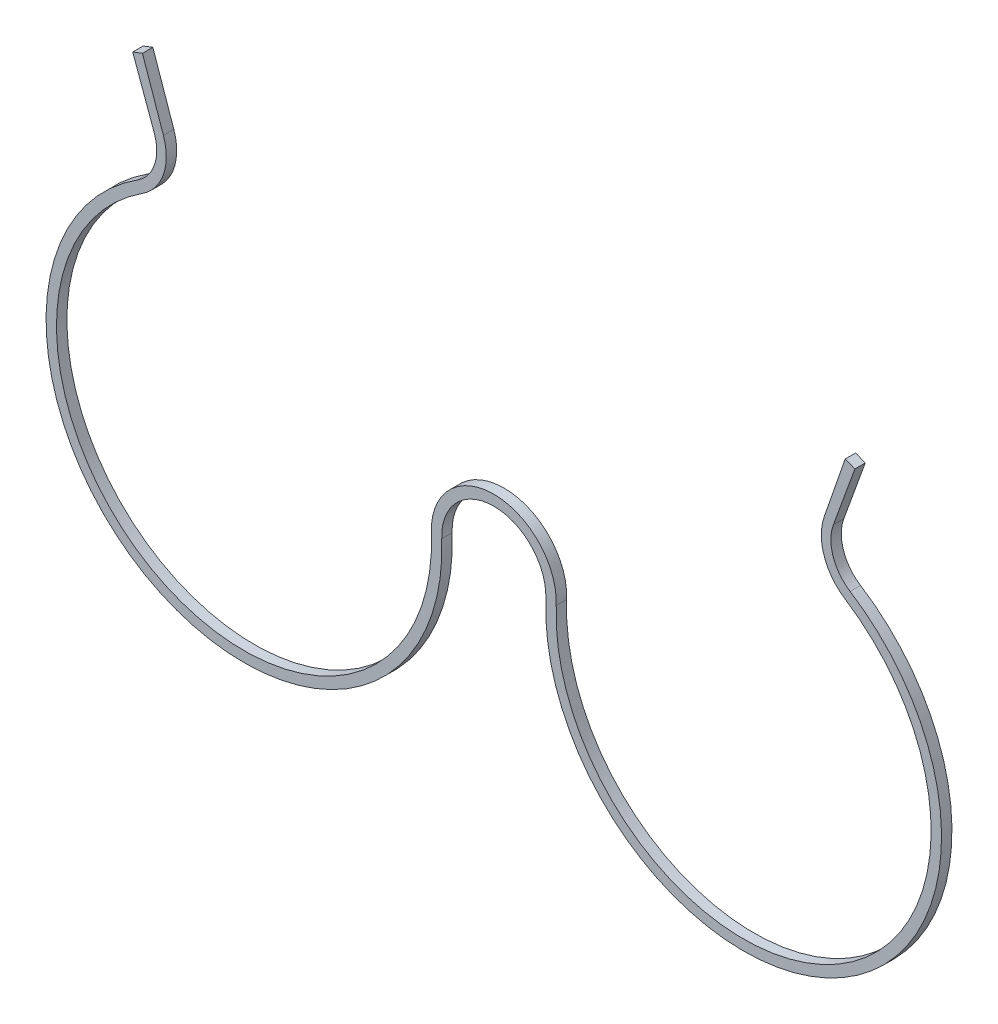
ISO-10303-21;
HEADER;
FILE_DESCRIPTION(('STEP AP214'),'2;1');
FILE_NAME('part.step','',(''),(''),'','','');
FILE_SCHEMA(('AUTOMOTIVE_DESIGN { 1 0 10303 214 1 1 1 1 }'));
ENDSEC;
DATA;
#1=APPLICATION_CONTEXT('core data for automotive mechanical design processes');
#2=APPLICATION_PROTOCOL_DEFINITION('international standard','automotive_design',2000,#1);
#3=PRODUCT_CONTEXT('',#1,'mechanical');
#4=PRODUCT('Part','Part','',(#3));
#5=PRODUCT_RELATED_PRODUCT_CATEGORY('part','',(#4));
#6=PRODUCT_DEFINITION_FORMATION('','',#4);
#7=PRODUCT_DEFINITION_CONTEXT('part definition',#1,'design');
#8=PRODUCT_DEFINITION('design','',#6,#7);
#9=PRODUCT_DEFINITION_SHAPE('','',#8);
#10=(LENGTH_UNIT() NAMED_UNIT(*) SI_UNIT(.MILLI.,.METRE.));
#11=(NAMED_UNIT(*) PLANE_ANGLE_UNIT() SI_UNIT($,.RADIAN.));
#12=(NAMED_UNIT(*) SI_UNIT($,.STERADIAN.) SOLID_ANGLE_UNIT());
#13=UNCERTAINTY_MEASURE_WITH_UNIT(LENGTH_MEASURE(1.E-05),#10,'distance_accuracy_value','');
#14=(GEOMETRIC_REPRESENTATION_CONTEXT(3) GLOBAL_UNCERTAINTY_ASSIGNED_CONTEXT((#13)) GLOBAL_UNIT_ASSIGNED_CONTEXT((#10,
#11,#12)) REPRESENTATION_CONTEXT('',''));
#15=CARTESIAN_POINT('',(0.,0.,0.));
#16=DIRECTION('',(0.,0.,1.));
#17=DIRECTION('',(1.,0.,0.));
#18=AXIS2_PLACEMENT_3D('',#15,#16,#17);
#19=CARTESIAN_POINT('',(0.0208423834364042,0.999999999999996,-1.));
#20=DIRECTION('',(0.,0.,1.));
#21=DIRECTION('',(1.,0.,0.));
#22=AXIS2_PLACEMENT_3D('',#19,#20,#21);
#23=CYLINDRICAL_SURFACE('',#22,4.99999999999999);
#24=CARTESIAN_POINT('',(0.0208423834364042,0.999999999999996,0.));
#25=DIRECTION('',(0.,0.,-1.));
#26=DIRECTION('',(1.,0.,0.));
#27=AXIS2_PLACEMENT_3D('',#24,#25,#26);
#28=CIRCLE('',#27,4.99999999999999);
#29=CARTESIAN_POINT('',(-4.97481545334767,0.79166666666666,0.));
#30=VERTEX_POINT('',#29);
#31=CARTESIAN_POINT('',(5.01650022022048,0.79166666666666,0.));
#32=VERTEX_POINT('',#31);
#33=EDGE_CURVE('E137',#30,#32,#28,.T.);
#34=ORIENTED_EDGE('',*,*,#33,.F.);
#35=DIRECTION('',(0.,0.,1.));
#36=VECTOR('',#35,1.);
#37=CARTESIAN_POINT('',(-4.97481545334767,0.79166666666666,-1.));
#38=LINE('',#37,#36);
#39=CARTESIAN_POINT('',(-4.97481545334767,0.79166666666666,-1.));
#40=VERTEX_POINT('',#39);
#41=EDGE_CURVE('E193',#40,#30,#38,.T.);
#42=ORIENTED_EDGE('',*,*,#41,.F.);
#43=CARTESIAN_POINT('',(0.0208423834364042,0.999999999999996,-1.));
#44=DIRECTION('',(0.,0.,-1.));
#45=DIRECTION('',(1.,0.,0.));
#46=AXIS2_PLACEMENT_3D('',#43,#44,#45);
#47=CIRCLE('',#46,4.99999999999999);
#48=CARTESIAN_POINT('',(5.01650022022048,0.79166666666666,-1.));
#49=VERTEX_POINT('',#48);
#50=EDGE_CURVE('E161',#40,#49,#47,.T.);
#51=ORIENTED_EDGE('',*,*,#50,.T.);
#52=DIRECTION('',(0.,0.,1.));
#53=VECTOR('',#52,1.);
#54=CARTESIAN_POINT('',(5.01650022022048,0.79166666666666,-1.));
#55=LINE('',#54,#53);
#56=EDGE_CURVE('E36',#49,#32,#55,.T.);
#57=ORIENTED_EDGE('',*,*,#56,.T.);
#58=EDGE_LOOP('',(#34,#42,#51,#57));
#59=FACE_BOUND('',#58,.T.);
#60=ADVANCED_FACE('F33',(#59),#23,.F.);
#61=CARTESIAN_POINT('',(0.0208423834364042,0.999999999999996,-1.));
#62=DIRECTION('',(0.,0.,1.));
#63=DIRECTION('',(1.,0.,0.));
#64=AXIS2_PLACEMENT_3D('',#61,#62,#63);
#65=CYLINDRICAL_SURFACE('',#64,6.);
#66=CARTESIAN_POINT('',(0.0208423834364042,0.999999999999996,0.));
#67=DIRECTION('',(0.,0.,1.));
#68=DIRECTION('',(1.,0.,0.));
#69=AXIS2_PLACEMENT_3D('',#66,#67,#68);
#70=CIRCLE('',#69,6.);
#71=CARTESIAN_POINT('',(6.0156317875773,0.749999999999993,0.));
#72=VERTEX_POINT('',#71);
#73=CARTESIAN_POINT('',(-5.97394702070449,0.749999999999993,0.));
#74=VERTEX_POINT('',#73);
#75=EDGE_CURVE('E159',#72,#74,#70,.T.);
#76=ORIENTED_EDGE('',*,*,#75,.F.);
#77=DIRECTION('',(0.,0.,1.));
#78=VECTOR('',#77,1.);
#79=CARTESIAN_POINT('',(6.0156317875773,0.749999999999993,-1.));
#80=LINE('',#79,#78);
#81=CARTESIAN_POINT('',(6.0156317875773,0.749999999999993,-1.));
#82=VERTEX_POINT('',#81);
#83=EDGE_CURVE('E11',#82,#72,#80,.T.);
#84=ORIENTED_EDGE('',*,*,#83,.F.);
#85=CARTESIAN_POINT('',(0.0208423834364042,0.999999999999996,-1.));
#86=DIRECTION('',(0.,0.,1.));
#87=DIRECTION('',(1.,0.,0.));
#88=AXIS2_PLACEMENT_3D('',#85,#86,#87);
#89=CIRCLE('',#88,6.);
#90=CARTESIAN_POINT('',(-5.97394702070449,0.749999999999993,-1.));
#91=VERTEX_POINT('',#90);
#92=EDGE_CURVE('E135',#82,#91,#89,.T.);
#93=ORIENTED_EDGE('',*,*,#92,.T.);
#94=DIRECTION('',(0.,0.,1.));
#95=VECTOR('',#94,1.);
#96=CARTESIAN_POINT('',(-5.97394702070449,0.749999999999993,-1.));
#97=LINE('',#96,#95);
#98=EDGE_CURVE('E141',#91,#74,#97,.T.);
#99=ORIENTED_EDGE('',*,*,#98,.T.);
#100=EDGE_LOOP('',(#76,#84,#93,#99));
#101=FACE_BOUND('',#100,.T.);
#102=ADVANCED_FACE('F233',(#101),#65,.T.);
#103=CARTESIAN_POINT('',(24.,0.,-1.));
#104=DIRECTION('',(0.,0.,1.));
#105=DIRECTION('',(1.,0.,0.));
#106=AXIS2_PLACEMENT_3D('',#103,#104,#105);
#107=CYLINDRICAL_SURFACE('',#106,18.);
#108=CARTESIAN_POINT('',(24.,0.,0.));
#109=DIRECTION('',(0.,0.,-1.));
#110=DIRECTION('',(1.,0.,0.));
#111=AXIS2_PLACEMENT_3D('',#108,#109,#110);
#112=CIRCLE('',#111,18.);
#113=CARTESIAN_POINT('',(33.7500402856871,15.1306547917623,0.));
#114=VERTEX_POINT('',#113);
#115=EDGE_CURVE('E156',#114,#72,#112,.T.);
#116=ORIENTED_EDGE('',*,*,#115,.F.);
#117=DIRECTION('',(0.,0.,1.));
#118=VECTOR('',#117,1.);
#119=CARTESIAN_POINT('',(33.7500402856871,15.1306547917623,-1.));
#120=LINE('',#119,#118);
#121=CARTESIAN_POINT('',(33.7500402856871,15.1306547917623,-1.));
#122=VERTEX_POINT('',#121);
#123=EDGE_CURVE('E42',#122,#114,#120,.T.);
#124=ORIENTED_EDGE('',*,*,#123,.F.);
#125=CARTESIAN_POINT('',(24.,0.,-1.));
#126=DIRECTION('',(0.,0.,-1.));
#127=DIRECTION('',(1.,0.,0.));
#128=AXIS2_PLACEMENT_3D('',#125,#126,#127);
#129=CIRCLE('',#128,18.);
#130=EDGE_CURVE('E125',#122,#82,#129,.T.);
#131=ORIENTED_EDGE('',*,*,#130,.T.);
#132=ORIENTED_EDGE('',*,*,#83,.T.);
#133=EDGE_LOOP('',(#116,#124,#131,#132));
#134=FACE_BOUND('',#133,.T.);
#135=ADVANCED_FACE('F237',(#134),#107,.F.);
#136=CARTESIAN_POINT('',(36.4583848094891,19.3336144561407,-1.));
#137=DIRECTION('',(0.,0.,1.));
#138=DIRECTION('',(1.,0.,0.));
#139=AXIS2_PLACEMENT_3D('',#136,#137,#138);
#140=CYLINDRICAL_SURFACE('',#139,5.);
#141=CARTESIAN_POINT('',(36.4583848094891,19.3336144561407,0.));
#142=DIRECTION('',(0.,0.,1.));
#143=DIRECTION('',(-1.,0.,0.));
#144=AXIS2_PLACEMENT_3D('',#141,#142,#143);
#145=CIRCLE('',#144,5.);
#146=CARTESIAN_POINT('',(31.7340197536941,20.9707994852633,0.));
#147=VERTEX_POINT('',#146);
#148=EDGE_CURVE('E110',#147,#114,#145,.T.);
#149=ORIENTED_EDGE('',*,*,#148,.F.);
#150=DIRECTION('',(0.,0.,1.));
#151=VECTOR('',#150,1.);
#152=CARTESIAN_POINT('',(31.7340197536941,20.9707994852633,-1.));
#153=LINE('',#152,#151);
#154=CARTESIAN_POINT('',(31.7340197536941,20.9707994852633,-1.));
#155=VERTEX_POINT('',#154);
#156=EDGE_CURVE('E105',#155,#147,#153,.T.);
#157=ORIENTED_EDGE('',*,*,#156,.F.);
#158=CARTESIAN_POINT('',(36.4583848094891,19.3336144561407,-1.));
#159=DIRECTION('',(0.,0.,1.));
#160=DIRECTION('',(-1.,0.,0.));
#161=AXIS2_PLACEMENT_3D('',#158,#159,#160);
#162=CIRCLE('',#161,5.);
#163=EDGE_CURVE('E108',#155,#122,#162,.T.);
#164=ORIENTED_EDGE('',*,*,#163,.T.);
#165=ORIENTED_EDGE('',*,*,#123,.T.);
#166=EDGE_LOOP('',(#149,#157,#164,#165));
#167=FACE_BOUND('',#166,.T.);
#168=ADVANCED_FACE('F107',(#167),#140,.T.);
#169=CARTESIAN_POINT('',(33.7475740847815,26.7812396923984,-1.));
#170=DIRECTION('',(-0.944873011158995,0.32743700582453,0.));
#171=DIRECTION('',(-0.32743700582453,-0.944873011158995,0.));
#172=AXIS2_PLACEMENT_3D('',#169,#170,#171);
#173=PLANE('',#172);
#174=DIRECTION('',(-0.32743700582453,-0.944873011158995,0.));
#175=VECTOR('',#174,1.);
#176=CARTESIAN_POINT('',(33.7475740847815,26.7812396923984,0.));
#177=LINE('',#176,#175);
#178=CARTESIAN_POINT('',(33.7475740847815,26.7812396923984,0.));
#179=VERTEX_POINT('',#178);
#180=EDGE_CURVE('E153',#179,#147,#177,.T.);
#181=ORIENTED_EDGE('',*,*,#180,.F.);
#182=DIRECTION('',(0.,0.,1.));
#183=VECTOR('',#182,1.);
#184=CARTESIAN_POINT('',(33.7475740847815,26.7812396923984,-1.));
#185=LINE('',#184,#183);
#186=CARTESIAN_POINT('',(33.7475740847815,26.7812396923984,-1.));
#187=VERTEX_POINT('',#186);
#188=EDGE_CURVE('E115',#187,#179,#185,.T.);
#189=ORIENTED_EDGE('',*,*,#188,.F.);
#190=DIRECTION('',(-0.32743700582453,-0.944873011158995,0.));
#191=VECTOR('',#190,1.);
#192=CARTESIAN_POINT('',(33.7475740847815,26.7812396923984,-1.));
#193=LINE('',#192,#191);
#194=EDGE_CURVE('E123',#187,#155,#193,.T.);
#195=ORIENTED_EDGE('',*,*,#194,.T.);
#196=ORIENTED_EDGE('',*,*,#156,.T.);
#197=EDGE_LOOP('',(#181,#189,#195,#196));
#198=FACE_BOUND('',#197,.T.);
#199=ADVANCED_FACE('F127',(#198),#173,.T.);
#200=CARTESIAN_POINT('',(24.,0.,-1.));
#201=DIRECTION('',(0.,0.,1.));
#202=DIRECTION('',(1.,0.,0.));
#203=AXIS2_PLACEMENT_3D('',#200,#201,#202);
#204=CYLINDRICAL_SURFACE('',#203,28.5);
#205=CARTESIAN_POINT('',(24.,0.,0.));
#206=DIRECTION('',(0.,0.,1.));
#207=DIRECTION('',(1.,0.,0.));
#208=AXIS2_PLACEMENT_3D('',#205,#206,#207);
#209=CIRCLE('',#208,28.5);
#210=CARTESIAN_POINT('',(34.6812645042071,26.4227286363684,0.));
#211=VERTEX_POINT('',#210);
#212=EDGE_CURVE('E150',#211,#179,#209,.T.);
#213=ORIENTED_EDGE('',*,*,#212,.F.);
#214=DIRECTION('',(0.,0.,1.));
#215=VECTOR('',#214,1.);
#216=CARTESIAN_POINT('',(34.6812645042071,26.4227286363684,-1.));
#217=LINE('',#216,#215);
#218=CARTESIAN_POINT('',(34.6812645042071,26.4227286363684,-1.));
#219=VERTEX_POINT('',#218);
#220=EDGE_CURVE('E165',#219,#211,#217,.T.);
#221=ORIENTED_EDGE('',*,*,#220,.F.);
#222=CARTESIAN_POINT('',(24.,0.,-1.));
#223=DIRECTION('',(0.,0.,1.));
#224=DIRECTION('',(1.,0.,0.));
#225=AXIS2_PLACEMENT_3D('',#222,#223,#224);
#226=CIRCLE('',#225,28.5);
#227=EDGE_CURVE('E128',#219,#187,#226,.T.);
#228=ORIENTED_EDGE('',*,*,#227,.T.);
#229=ORIENTED_EDGE('',*,*,#188,.T.);
#230=EDGE_LOOP('',(#213,#221,#228,#229));
#231=FACE_BOUND('',#230,.T.);
#232=ADVANCED_FACE('F223',(#231),#204,.T.);
#233=CARTESIAN_POINT('',(34.6812645042071,26.4227286363684,-1.));
#234=DIRECTION('',(0.93969262078591,-0.342020143325664,0.));
#235=DIRECTION('',(0.342020143325664,0.93969262078591,0.));
#236=AXIS2_PLACEMENT_3D('',#233,#234,#235);
#237=PLANE('',#236);
#238=DIRECTION('',(0.342020143325664,0.93969262078591,0.));
#239=VECTOR('',#238,1.);
#240=CARTESIAN_POINT('',(34.6812645042071,26.4227286363684,0.));
#241=LINE('',#240,#239);
#242=CARTESIAN_POINT('',(32.6180257949857,20.7540268718377,0.));
#243=VERTEX_POINT('',#242);
#244=EDGE_CURVE('E147',#243,#211,#241,.T.);
#245=ORIENTED_EDGE('',*,*,#244,.F.);
#246=DIRECTION('',(0.,0.,1.));
#247=VECTOR('',#246,1.);
#248=CARTESIAN_POINT('',(32.6180257949857,20.7540268718377,-1.));
#249=LINE('',#248,#247);
#250=CARTESIAN_POINT('',(32.6180257949857,20.7540268718377,-1.));
#251=VERTEX_POINT('',#250);
#252=EDGE_CURVE('E167',#251,#243,#249,.T.);
#253=ORIENTED_EDGE('',*,*,#252,.F.);
#254=DIRECTION('',(0.342020143325664,0.93969262078591,0.));
#255=VECTOR('',#254,1.);
#256=CARTESIAN_POINT('',(34.6812645042071,26.4227286363684,-1.));
#257=LINE('',#256,#255);
#258=EDGE_CURVE('E130',#251,#219,#257,.T.);
#259=ORIENTED_EDGE('',*,*,#258,.T.);
#260=ORIENTED_EDGE('',*,*,#220,.T.);
#261=EDGE_LOOP('',(#245,#253,#259,#260));
#262=FACE_BOUND('',#261,.T.);
#263=ADVANCED_FACE('F217',(#262),#237,.T.);
#264=CARTESIAN_POINT('',(36.3767962781293,19.385946298535,-1.));
#265=DIRECTION('',(0.,0.,1.));
#266=DIRECTION('',(1.,0.,0.));
#267=AXIS2_PLACEMENT_3D('',#264,#265,#266);
#268=CYLINDRICAL_SURFACE('',#267,4.);
#269=CARTESIAN_POINT('',(36.3767962781293,19.385946298535,0.));
#270=DIRECTION('',(0.,0.,-1.));
#271=DIRECTION('',(-1.,0.,0.));
#272=AXIS2_PLACEMENT_3D('',#269,#270,#271);
#273=CIRCLE('',#272,4.);
#274=CARTESIAN_POINT('',(34.2243099688894,16.0144773770507,0.));
#275=VERTEX_POINT('',#274);
#276=EDGE_CURVE('E144',#275,#243,#273,.T.);
#277=ORIENTED_EDGE('',*,*,#276,.F.);
#278=DIRECTION('',(0.,0.,1.));
#279=VECTOR('',#278,1.);
#280=CARTESIAN_POINT('',(34.2243099688894,16.0144773770507,-1.));
#281=LINE('',#280,#279);
#282=CARTESIAN_POINT('',(34.2243099688894,16.0144773770507,-1.));
#283=VERTEX_POINT('',#282);
#284=EDGE_CURVE('E168',#283,#275,#281,.T.);
#285=ORIENTED_EDGE('',*,*,#284,.F.);
#286=CARTESIAN_POINT('',(36.3767962781293,19.385946298535,-1.));
#287=DIRECTION('',(0.,0.,-1.));
#288=DIRECTION('',(-1.,0.,0.));
#289=AXIS2_PLACEMENT_3D('',#286,#287,#288);
#290=CIRCLE('',#289,4.);
#291=EDGE_CURVE('E211',#283,#251,#290,.T.);
#292=ORIENTED_EDGE('',*,*,#291,.T.);
#293=ORIENTED_EDGE('',*,*,#252,.T.);
#294=EDGE_LOOP('',(#277,#285,#292,#293));
#295=FACE_BOUND('',#294,.T.);
#296=ADVANCED_FACE('F221',(#295),#268,.F.);
#297=CARTESIAN_POINT('',(24.,0.,-1.));
#298=DIRECTION('',(0.,0.,1.));
#299=DIRECTION('',(1.,0.,0.));
#300=AXIS2_PLACEMENT_3D('',#297,#298,#299);
#301=CYLINDRICAL_SURFACE('',#300,19.);
#302=CARTESIAN_POINT('',(24.,0.,0.));
#303=DIRECTION('',(0.,0.,1.));
#304=DIRECTION('',(1.,0.,0.));
#305=AXIS2_PLACEMENT_3D('',#302,#303,#304);
#306=CIRCLE('',#305,19.);
#307=EDGE_CURVE('E140',#32,#275,#306,.T.);
#308=ORIENTED_EDGE('',*,*,#307,.F.);
#309=ORIENTED_EDGE('',*,*,#56,.F.);
#310=CARTESIAN_POINT('',(24.,0.,-1.));
#311=DIRECTION('',(0.,0.,1.));
#312=DIRECTION('',(1.,0.,0.));
#313=AXIS2_PLACEMENT_3D('',#310,#311,#312);
#314=CIRCLE('',#313,19.);
#315=EDGE_CURVE('E209',#49,#283,#314,.T.);
#316=ORIENTED_EDGE('',*,*,#315,.T.);
#317=ORIENTED_EDGE('',*,*,#284,.T.);
#318=EDGE_LOOP('',(#308,#309,#316,#317));
#319=FACE_BOUND('',#318,.T.);
#320=ADVANCED_FACE('F176',(#319),#301,.T.);
#321=CARTESIAN_POINT('',(0.0208423834364042,0.999999999999996,-1.));
#322=DIRECTION('',(0.,0.,1.));
#323=DIRECTION('',(1.,0.,0.));
#324=AXIS2_PLACEMENT_3D('',#321,#322,#323);
#325=PLANE('',#324);
#326=ORIENTED_EDGE('',*,*,#50,.F.);
#327=CARTESIAN_POINT('',(-23.9583152331272,0.,-1.));
#328=DIRECTION('',(0.,0.,-1.));
#329=DIRECTION('',(-1.,0.,0.));
#330=AXIS2_PLACEMENT_3D('',#327,#328,#329);
#331=CIRCLE('',#330,19.);
#332=CARTESIAN_POINT('',(-34.1826252020166,16.0144773770507,-1.));
#333=VERTEX_POINT('',#332);
#334=EDGE_CURVE('E197',#40,#333,#331,.T.);
#335=ORIENTED_EDGE('',*,*,#334,.T.);
#336=CARTESIAN_POINT('',(-36.3351115112565,19.385946298535,-1.));
#337=DIRECTION('',(0.,0.,1.));
#338=DIRECTION('',(1.,0.,0.));
#339=AXIS2_PLACEMENT_3D('',#336,#337,#338);
#340=CIRCLE('',#339,4.);
#341=CARTESIAN_POINT('',(-32.5763410281129,20.7540268718377,-1.));
#342=VERTEX_POINT('',#341);
#343=EDGE_CURVE('E460',#333,#342,#340,.T.);
#344=ORIENTED_EDGE('',*,*,#343,.T.);
#345=DIRECTION('',(-0.342020143325664,0.93969262078591,0.));
#346=VECTOR('',#345,1.);
#347=CARTESIAN_POINT('',(-34.6395797373343,26.4227286363684,-1.));
#348=LINE('',#347,#346);
#349=CARTESIAN_POINT('',(-34.6395797373343,26.4227286363684,-1.));
#350=VERTEX_POINT('',#349);
#351=EDGE_CURVE('E401',#342,#350,#348,.T.);
#352=ORIENTED_EDGE('',*,*,#351,.T.);
#353=CARTESIAN_POINT('',(-23.9583152331272,0.,-1.));
#354=DIRECTION('',(0.,0.,-1.));
#355=DIRECTION('',(-1.,0.,0.));
#356=AXIS2_PLACEMENT_3D('',#353,#354,#355);
#357=CIRCLE('',#356,28.5);
#358=CARTESIAN_POINT('',(-33.7058893179087,26.7812396923984,-1.));
#359=VERTEX_POINT('',#358);
#360=EDGE_CURVE('E435',#350,#359,#357,.T.);
#361=ORIENTED_EDGE('',*,*,#360,.T.);
#362=DIRECTION('',(0.32743700582453,-0.944873011158995,0.));
#363=VECTOR('',#362,1.);
#364=CARTESIAN_POINT('',(-33.7058893179087,26.7812396923984,-1.));
#365=LINE('',#364,#363);
#366=CARTESIAN_POINT('',(-31.6923349868213,20.9707994852633,-1.));
#367=VERTEX_POINT('',#366);
#368=EDGE_CURVE('E466',#359,#367,#365,.T.);
#369=ORIENTED_EDGE('',*,*,#368,.T.);
#370=CARTESIAN_POINT('',(-36.4167000426163,19.3336144561407,-1.));
#371=DIRECTION('',(0.,0.,-1.));
#372=DIRECTION('',(1.,0.,0.));
#373=AXIS2_PLACEMENT_3D('',#370,#371,#372);
#374=CIRCLE('',#373,5.);
#375=CARTESIAN_POINT('',(-33.7083555188143,15.1306547917623,-1.));
#376=VERTEX_POINT('',#375);
#377=EDGE_CURVE('E204',#367,#376,#374,.T.);
#378=ORIENTED_EDGE('',*,*,#377,.T.);
#379=CARTESIAN_POINT('',(-23.9583152331272,0.,-1.));
#380=DIRECTION('',(0.,0.,1.));
#381=DIRECTION('',(-1.,0.,0.));
#382=AXIS2_PLACEMENT_3D('',#379,#380,#381);
#383=CIRCLE('',#382,18.);
#384=EDGE_CURVE('E199',#376,#91,#383,.T.);
#385=ORIENTED_EDGE('',*,*,#384,.T.);
#386=ORIENTED_EDGE('',*,*,#92,.F.);
#387=ORIENTED_EDGE('',*,*,#130,.F.);
#388=ORIENTED_EDGE('',*,*,#163,.F.);
#389=ORIENTED_EDGE('',*,*,#194,.F.);
#390=ORIENTED_EDGE('',*,*,#227,.F.);
#391=ORIENTED_EDGE('',*,*,#258,.F.);
#392=ORIENTED_EDGE('',*,*,#291,.F.);
#393=ORIENTED_EDGE('',*,*,#315,.F.);
#394=EDGE_LOOP('',(#326,#335,#344,#352,#361,#369,#378,#385,#386,#387,#388,#389,#390,#391,#392,#393));
#395=FACE_BOUND('',#394,.T.);
#396=ADVANCED_FACE('F121',(#395),#325,.F.);
#397=CARTESIAN_POINT('',(0.0208423834364042,0.999999999999996,0.));
#398=DIRECTION('',(0.,0.,1.));
#399=DIRECTION('',(1.,0.,0.));
#400=AXIS2_PLACEMENT_3D('',#397,#398,#399);
#401=PLANE('',#400);
#402=ORIENTED_EDGE('',*,*,#33,.T.);
#403=ORIENTED_EDGE('',*,*,#307,.T.);
#404=ORIENTED_EDGE('',*,*,#276,.T.);
#405=ORIENTED_EDGE('',*,*,#244,.T.);
#406=ORIENTED_EDGE('',*,*,#212,.T.);
#407=ORIENTED_EDGE('',*,*,#180,.T.);
#408=ORIENTED_EDGE('',*,*,#148,.T.);
#409=ORIENTED_EDGE('',*,*,#115,.T.);
#410=ORIENTED_EDGE('',*,*,#75,.T.);
#411=CARTESIAN_POINT('',(-23.9583152331272,0.,0.));
#412=DIRECTION('',(0.,0.,1.));
#413=DIRECTION('',(-1.,0.,0.));
#414=AXIS2_PLACEMENT_3D('',#411,#412,#413);
#415=CIRCLE('',#414,18.);
#416=CARTESIAN_POINT('',(-33.7083555188143,15.1306547917623,0.));
#417=VERTEX_POINT('',#416);
#418=EDGE_CURVE('E416',#417,#74,#415,.T.);
#419=ORIENTED_EDGE('',*,*,#418,.F.);
#420=CARTESIAN_POINT('',(-36.4167000426163,19.3336144561407,0.));
#421=DIRECTION('',(0.,0.,-1.));
#422=DIRECTION('',(1.,0.,0.));
#423=AXIS2_PLACEMENT_3D('',#420,#421,#422);
#424=CIRCLE('',#423,5.);
#425=CARTESIAN_POINT('',(-31.6923349868213,20.9707994852633,0.));
#426=VERTEX_POINT('',#425);
#427=EDGE_CURVE('E413',#426,#417,#424,.T.);
#428=ORIENTED_EDGE('',*,*,#427,.F.);
#429=DIRECTION('',(0.32743700582453,-0.944873011158995,0.));
#430=VECTOR('',#429,1.);
#431=CARTESIAN_POINT('',(-33.7058893179087,26.7812396923984,0.));
#432=LINE('',#431,#430);
#433=CARTESIAN_POINT('',(-33.7058893179087,26.7812396923984,0.));
#434=VERTEX_POINT('',#433);
#435=EDGE_CURVE('E408',#434,#426,#432,.T.);
#436=ORIENTED_EDGE('',*,*,#435,.F.);
#437=CARTESIAN_POINT('',(-23.9583152331272,0.,0.));
#438=DIRECTION('',(0.,0.,-1.));
#439=DIRECTION('',(-1.,0.,0.));
#440=AXIS2_PLACEMENT_3D('',#437,#438,#439);
#441=CIRCLE('',#440,28.5);
#442=CARTESIAN_POINT('',(-34.6395797373343,26.4227286363684,0.));
#443=VERTEX_POINT('',#442);
#444=EDGE_CURVE('E406',#443,#434,#441,.T.);
#445=ORIENTED_EDGE('',*,*,#444,.F.);
#446=DIRECTION('',(-0.342020143325664,0.93969262078591,0.));
#447=VECTOR('',#446,1.);
#448=CARTESIAN_POINT('',(-34.6395797373343,26.4227286363684,0.));
#449=LINE('',#448,#447);
#450=CARTESIAN_POINT('',(-32.5763410281129,20.7540268718377,0.));
#451=VERTEX_POINT('',#450);
#452=EDGE_CURVE('E395',#451,#443,#449,.T.);
#453=ORIENTED_EDGE('',*,*,#452,.F.);
#454=CARTESIAN_POINT('',(-36.3351115112565,19.385946298535,0.));
#455=DIRECTION('',(0.,0.,1.));
#456=DIRECTION('',(1.,0.,0.));
#457=AXIS2_PLACEMENT_3D('',#454,#455,#456);
#458=CIRCLE('',#457,4.);
#459=CARTESIAN_POINT('',(-34.1826252020166,16.0144773770507,0.));
#460=VERTEX_POINT('',#459);
#461=EDGE_CURVE('E186',#460,#451,#458,.T.);
#462=ORIENTED_EDGE('',*,*,#461,.F.);
#463=CARTESIAN_POINT('',(-23.9583152331272,0.,0.));
#464=DIRECTION('',(0.,0.,-1.));
#465=DIRECTION('',(-1.,0.,0.));
#466=AXIS2_PLACEMENT_3D('',#463,#464,#465);
#467=CIRCLE('',#466,19.);
#468=EDGE_CURVE('E181',#30,#460,#467,.T.);
#469=ORIENTED_EDGE('',*,*,#468,.F.);
#470=EDGE_LOOP('',(#402,#403,#404,#405,#406,#407,#408,#409,#410,#419,#428,#436,#445,#453,#462,#469));
#471=FACE_BOUND('',#470,.T.);
#472=ADVANCED_FACE('F178',(#471),#401,.T.);
#473=CARTESIAN_POINT('',(-23.9583152331272,0.,-1.));
#474=DIRECTION('',(0.,0.,1.));
#475=DIRECTION('',(-1.,0.,0.));
#476=AXIS2_PLACEMENT_3D('',#473,#474,#475);
#477=CYLINDRICAL_SURFACE('',#476,18.);
#478=ORIENTED_EDGE('',*,*,#418,.T.);
#479=ORIENTED_EDGE('',*,*,#98,.F.);
#480=ORIENTED_EDGE('',*,*,#384,.F.);
#481=DIRECTION('',(0.,0.,1.));
#482=VECTOR('',#481,1.);
#483=CARTESIAN_POINT('',(-33.7083555188143,15.1306547917623,-1.));
#484=LINE('',#483,#482);
#485=EDGE_CURVE('E421',#376,#417,#484,.T.);
#486=ORIENTED_EDGE('',*,*,#485,.T.);
#487=EDGE_LOOP('',(#478,#479,#480,#486));
#488=FACE_BOUND('',#487,.T.);
#489=ADVANCED_FACE('F300',(#488),#477,.F.);
#490=CARTESIAN_POINT('',(-36.4167000426163,19.3336144561407,-1.));
#491=DIRECTION('',(0.,0.,1.));
#492=DIRECTION('',(-1.,0.,0.));
#493=AXIS2_PLACEMENT_3D('',#490,#491,#492);
#494=CYLINDRICAL_SURFACE('',#493,5.);
#495=ORIENTED_EDGE('',*,*,#427,.T.);
#496=ORIENTED_EDGE('',*,*,#485,.F.);
#497=ORIENTED_EDGE('',*,*,#377,.F.);
#498=DIRECTION('',(0.,0.,1.));
#499=VECTOR('',#498,1.);
#500=CARTESIAN_POINT('',(-31.6923349868213,20.9707994852633,-1.));
#501=LINE('',#500,#499);
#502=EDGE_CURVE('E424',#367,#426,#501,.T.);
#503=ORIENTED_EDGE('',*,*,#502,.T.);
#504=EDGE_LOOP('',(#495,#496,#497,#503));
#505=FACE_BOUND('',#504,.T.);
#506=ADVANCED_FACE('F325',(#505),#494,.T.);
#507=CARTESIAN_POINT('',(-33.7058893179087,26.7812396923984,-1.));
#508=DIRECTION('',(0.944873011158995,0.32743700582453,0.));
#509=DIRECTION('',(0.32743700582453,-0.944873011158995,0.));
#510=AXIS2_PLACEMENT_3D('',#507,#508,#509);
#511=PLANE('',#510);
#512=ORIENTED_EDGE('',*,*,#435,.T.);
#513=ORIENTED_EDGE('',*,*,#502,.F.);
#514=ORIENTED_EDGE('',*,*,#368,.F.);
#515=DIRECTION('',(0.,0.,1.));
#516=VECTOR('',#515,1.);
#517=CARTESIAN_POINT('',(-33.7058893179087,26.7812396923984,-1.));
#518=LINE('',#517,#516);
#519=EDGE_CURVE('E427',#359,#434,#518,.T.);
#520=ORIENTED_EDGE('',*,*,#519,.T.);
#521=EDGE_LOOP('',(#512,#513,#514,#520));
#522=FACE_BOUND('',#521,.T.);
#523=ADVANCED_FACE('F335',(#522),#511,.T.);
#524=CARTESIAN_POINT('',(-23.9583152331272,0.,-1.));
#525=DIRECTION('',(0.,0.,1.));
#526=DIRECTION('',(-1.,0.,0.));
#527=AXIS2_PLACEMENT_3D('',#524,#525,#526);
#528=CYLINDRICAL_SURFACE('',#527,28.5);
#529=ORIENTED_EDGE('',*,*,#444,.T.);
#530=ORIENTED_EDGE('',*,*,#519,.F.);
#531=ORIENTED_EDGE('',*,*,#360,.F.);
#532=DIRECTION('',(0.,0.,1.));
#533=VECTOR('',#532,1.);
#534=CARTESIAN_POINT('',(-34.6395797373343,26.4227286363684,-1.));
#535=LINE('',#534,#533);
#536=EDGE_CURVE('E402',#350,#443,#535,.T.);
#537=ORIENTED_EDGE('',*,*,#536,.T.);
#538=EDGE_LOOP('',(#529,#530,#531,#537));
#539=FACE_BOUND('',#538,.T.);
#540=ADVANCED_FACE('F345',(#539),#528,.T.);
#541=CARTESIAN_POINT('',(-34.6395797373343,26.4227286363684,-1.));
#542=DIRECTION('',(-0.93969262078591,-0.342020143325664,0.));
#543=DIRECTION('',(-0.342020143325664,0.93969262078591,0.));
#544=AXIS2_PLACEMENT_3D('',#541,#542,#543);
#545=PLANE('',#544);
#546=ORIENTED_EDGE('',*,*,#452,.T.);
#547=ORIENTED_EDGE('',*,*,#536,.F.);
#548=ORIENTED_EDGE('',*,*,#351,.F.);
#549=DIRECTION('',(0.,0.,1.));
#550=VECTOR('',#549,1.);
#551=CARTESIAN_POINT('',(-32.5763410281129,20.7540268718377,-1.));
#552=LINE('',#551,#550);
#553=EDGE_CURVE('E201',#342,#451,#552,.T.);
#554=ORIENTED_EDGE('',*,*,#553,.T.);
#555=EDGE_LOOP('',(#546,#547,#548,#554));
#556=FACE_BOUND('',#555,.T.);
#557=ADVANCED_FACE('F355',(#556),#545,.T.);
#558=CARTESIAN_POINT('',(-36.3351115112565,19.385946298535,-1.));
#559=DIRECTION('',(0.,0.,1.));
#560=DIRECTION('',(-1.,0.,0.));
#561=AXIS2_PLACEMENT_3D('',#558,#559,#560);
#562=CYLINDRICAL_SURFACE('',#561,4.);
#563=ORIENTED_EDGE('',*,*,#461,.T.);
#564=ORIENTED_EDGE('',*,*,#553,.F.);
#565=ORIENTED_EDGE('',*,*,#343,.F.);
#566=DIRECTION('',(0.,0.,1.));
#567=VECTOR('',#566,1.);
#568=CARTESIAN_POINT('',(-34.1826252020166,16.0144773770507,-1.));
#569=LINE('',#568,#567);
#570=EDGE_CURVE('E198',#333,#460,#569,.T.);
#571=ORIENTED_EDGE('',*,*,#570,.T.);
#572=EDGE_LOOP('',(#563,#564,#565,#571));
#573=FACE_BOUND('',#572,.T.);
#574=ADVANCED_FACE('F365',(#573),#562,.F.);
#575=CARTESIAN_POINT('',(-23.9583152331272,0.,-1.));
#576=DIRECTION('',(0.,0.,1.));
#577=DIRECTION('',(-1.,0.,0.));
#578=AXIS2_PLACEMENT_3D('',#575,#576,#577);
#579=CYLINDRICAL_SURFACE('',#578,19.);
#580=ORIENTED_EDGE('',*,*,#468,.T.);
#581=ORIENTED_EDGE('',*,*,#570,.F.);
#582=ORIENTED_EDGE('',*,*,#334,.F.);
#583=ORIENTED_EDGE('',*,*,#41,.T.);
#584=EDGE_LOOP('',(#580,#581,#582,#583));
#585=FACE_BOUND('',#584,.T.);
#586=ADVANCED_FACE('F194',(#585),#579,.T.);
#587=CLOSED_SHELL('',(#60,#102,#135,#168,#199,#232,#263,#296,#320,#396,#472,#489,#506,#523,#540,
#557,#574,#586));
#588=MANIFOLD_SOLID_BREP('B2',#587);
#589=ADVANCED_BREP_SHAPE_REPRESENTATION('',(#18,#588),#14);
#590=SHAPE_DEFINITION_REPRESENTATION(#9,#589);
ENDSEC;
END-ISO-10303-21;
